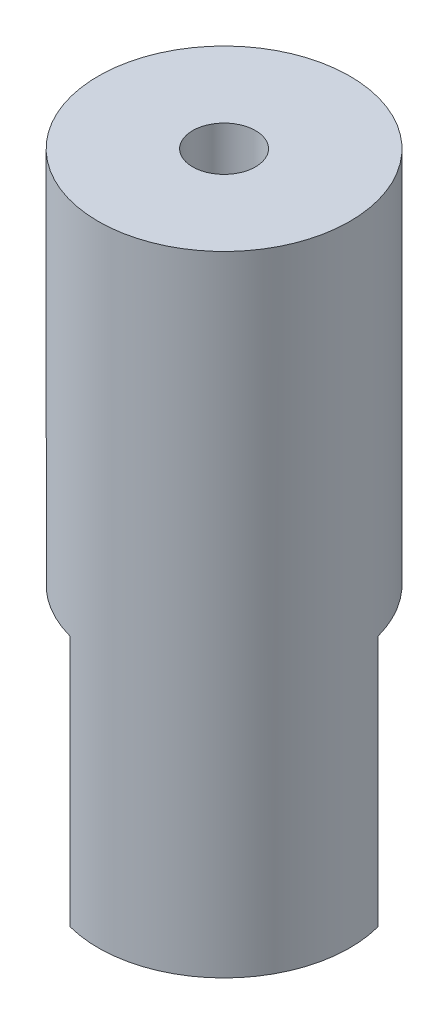
ISO-10303-21;
HEADER;
FILE_DESCRIPTION(('STEP AP214'),'2;1');
FILE_NAME('part.step','',(''),(''),'','','');
FILE_SCHEMA(('AUTOMOTIVE_DESIGN { 1 0 10303 214 1 1 1 1 }'));
ENDSEC;
DATA;
#1=APPLICATION_CONTEXT('core data for automotive mechanical design processes');
#2=APPLICATION_PROTOCOL_DEFINITION('international standard','automotive_design',2000,#1);
#3=PRODUCT_CONTEXT('',#1,'mechanical');
#4=PRODUCT('Part','Part','',(#3));
#5=PRODUCT_RELATED_PRODUCT_CATEGORY('part','',(#4));
#6=PRODUCT_DEFINITION_FORMATION('','',#4);
#7=PRODUCT_DEFINITION_CONTEXT('part definition',#1,'design');
#8=PRODUCT_DEFINITION('design','',#6,#7);
#9=PRODUCT_DEFINITION_SHAPE('','',#8);
#10=(LENGTH_UNIT() NAMED_UNIT(*) SI_UNIT(.MILLI.,.METRE.));
#11=(NAMED_UNIT(*) PLANE_ANGLE_UNIT() SI_UNIT($,.RADIAN.));
#12=(NAMED_UNIT(*) SI_UNIT($,.STERADIAN.) SOLID_ANGLE_UNIT());
#13=UNCERTAINTY_MEASURE_WITH_UNIT(LENGTH_MEASURE(1.E-05),#10,'distance_accuracy_value','');
#14=(GEOMETRIC_REPRESENTATION_CONTEXT(3) GLOBAL_UNCERTAINTY_ASSIGNED_CONTEXT((#13)) GLOBAL_UNIT_ASSIGNED_CONTEXT((#10,
#11,#12)) REPRESENTATION_CONTEXT('',''));
#15=CARTESIAN_POINT('',(0.,0.,0.));
#16=DIRECTION('',(0.,0.,1.));
#17=DIRECTION('',(1.,0.,0.));
#18=AXIS2_PLACEMENT_3D('',#15,#16,#17);
#19=CARTESIAN_POINT('',(0.,0.,0.));
#20=DIRECTION('',(0.,1.,0.));
#21=DIRECTION('',(0.,0.,1.));
#22=AXIS2_PLACEMENT_3D('',#19,#20,#21);
#23=PLANE('',#22);
#24=CARTESIAN_POINT('',(0.,0.,0.));
#25=DIRECTION('',(0.,1.,0.));
#26=DIRECTION('',(0.,0.,1.));
#27=AXIS2_PLACEMENT_3D('',#24,#25,#26);
#28=CIRCLE('',#27,2.49999999999999);
#29=CARTESIAN_POINT('',(0.,0.,2.49999999999999));
#30=VERTEX_POINT('',#29);
#31=EDGE_CURVE('E70',#30,#30,#28,.T.);
#32=ORIENTED_EDGE('',*,*,#31,.T.);
#33=EDGE_LOOP('',(#32));
#34=FACE_BOUND('',#33,.T.);
#35=DIRECTION('',(0.707106781186548,0.,-0.707106781186548));
#36=VECTOR('',#35,1.);
#37=CARTESIAN_POINT('',(9.65925826289068,0.,-2.58819045102521));
#38=LINE('',#37,#36);
#39=CARTESIAN_POINT('',(-2.58819045102521,0.,9.65925826289068));
#40=VERTEX_POINT('',#39);
#41=CARTESIAN_POINT('',(9.65925826289068,0.,-2.58819045102521));
#42=VERTEX_POINT('',#41);
#43=EDGE_CURVE('E54',#40,#42,#38,.T.);
#44=ORIENTED_EDGE('',*,*,#43,.F.);
#45=CARTESIAN_POINT('',(0.,0.,0.));
#46=DIRECTION('',(0.,1.,0.));
#47=DIRECTION('',(0.,0.,1.));
#48=AXIS2_PLACEMENT_3D('',#45,#46,#47);
#49=CIRCLE('',#48,10.);
#50=EDGE_CURVE('E47',#42,#40,#49,.T.);
#51=ORIENTED_EDGE('',*,*,#50,.F.);
#52=EDGE_LOOP('',(#44,#51));
#53=FACE_BOUND('',#52,.T.);
#54=ADVANCED_FACE('F38',(#34,#53),#23,.F.);
#55=CARTESIAN_POINT('',(0.,30.,0.));
#56=DIRECTION('',(0.,-1.,0.));
#57=DIRECTION('',(0.,0.,-1.));
#58=AXIS2_PLACEMENT_3D('',#55,#56,#57);
#59=CYLINDRICAL_SURFACE('',#58,10.);
#60=CARTESIAN_POINT('',(0.,30.,0.));
#61=DIRECTION('',(0.,1.,0.));
#62=DIRECTION('',(0.,0.,1.));
#63=AXIS2_PLACEMENT_3D('',#60,#61,#62);
#64=CIRCLE('',#63,10.);
#65=CARTESIAN_POINT('',(0.,30.,10.));
#66=VERTEX_POINT('',#65);
#67=EDGE_CURVE('E11',#66,#66,#64,.T.);
#68=ORIENTED_EDGE('',*,*,#67,.F.);
#69=EDGE_LOOP('',(#68));
#70=FACE_BOUND('',#69,.T.);
#71=ORIENTED_EDGE('',*,*,#50,.T.);
#72=DIRECTION('',(0.,1.,0.));
#73=VECTOR('',#72,1.);
#74=CARTESIAN_POINT('',(-2.58819045102521,-20.,9.65925826289068));
#75=LINE('',#74,#73);
#76=CARTESIAN_POINT('',(-2.58819045102521,-20.,9.65925826289068));
#77=VERTEX_POINT('',#76);
#78=EDGE_CURVE('E76',#77,#40,#75,.T.);
#79=ORIENTED_EDGE('',*,*,#78,.F.);
#80=CARTESIAN_POINT('',(0.,-20.,0.));
#81=DIRECTION('',(0.,-1.,0.));
#82=DIRECTION('',(0.,0.,-1.));
#83=AXIS2_PLACEMENT_3D('',#80,#81,#82);
#84=CIRCLE('',#83,10.);
#85=CARTESIAN_POINT('',(9.65925826289068,-20.,-2.58819045102521));
#86=VERTEX_POINT('',#85);
#87=EDGE_CURVE('E77',#86,#77,#84,.T.);
#88=ORIENTED_EDGE('',*,*,#87,.F.);
#89=DIRECTION('',(0.,1.,0.));
#90=VECTOR('',#89,1.);
#91=CARTESIAN_POINT('',(9.65925826289068,-20.,-2.58819045102521));
#92=LINE('',#91,#90);
#93=EDGE_CURVE('E74',#86,#42,#92,.T.);
#94=ORIENTED_EDGE('',*,*,#93,.T.);
#95=EDGE_LOOP('',(#71,#79,#88,#94));
#96=FACE_BOUND('',#95,.T.);
#97=ADVANCED_FACE('F40',(#70,#96),#59,.T.);
#98=CARTESIAN_POINT('',(0.,30.,0.));
#99=DIRECTION('',(0.,1.,0.));
#100=DIRECTION('',(0.,0.,1.));
#101=AXIS2_PLACEMENT_3D('',#98,#99,#100);
#102=PLANE('',#101);
#103=CARTESIAN_POINT('',(0.,30.,0.));
#104=DIRECTION('',(0.,1.,0.));
#105=DIRECTION('',(0.,0.,1.));
#106=AXIS2_PLACEMENT_3D('',#103,#104,#105);
#107=CIRCLE('',#106,2.5);
#108=CARTESIAN_POINT('',(0.,30.,2.5));
#109=VERTEX_POINT('',#108);
#110=EDGE_CURVE('E80',#109,#109,#107,.T.);
#111=ORIENTED_EDGE('',*,*,#110,.F.);
#112=EDGE_LOOP('',(#111));
#113=FACE_BOUND('',#112,.T.);
#114=ORIENTED_EDGE('',*,*,#67,.T.);
#115=EDGE_LOOP('',(#114));
#116=FACE_BOUND('',#115,.T.);
#117=ADVANCED_FACE('F99',(#113,#116),#102,.T.);
#118=CARTESIAN_POINT('',(0.,30.,0.));
#119=DIRECTION('',(0.,1.,0.));
#120=DIRECTION('',(0.,0.,1.));
#121=AXIS2_PLACEMENT_3D('',#118,#119,#120);
#122=CYLINDRICAL_SURFACE('',#121,2.49999999999999);
#123=ORIENTED_EDGE('',*,*,#31,.F.);
#124=EDGE_LOOP('',(#123));
#125=FACE_BOUND('',#124,.T.);
#126=ORIENTED_EDGE('',*,*,#110,.T.);
#127=EDGE_LOOP('',(#126));
#128=FACE_BOUND('',#127,.T.);
#129=ADVANCED_FACE('F96',(#125,#128),#122,.F.);
#130=CARTESIAN_POINT('',(9.65925826289068,-20.,-2.58819045102521));
#131=DIRECTION('',(0.707106781186548,0.,0.707106781186548));
#132=DIRECTION('',(0.707106781186548,0.,-0.707106781186548));
#133=AXIS2_PLACEMENT_3D('',#130,#131,#132);
#134=PLANE('',#133);
#135=ORIENTED_EDGE('',*,*,#43,.T.);
#136=ORIENTED_EDGE('',*,*,#93,.F.);
#137=DIRECTION('',(0.707106781186548,0.,-0.707106781186548));
#138=VECTOR('',#137,1.);
#139=CARTESIAN_POINT('',(9.65925826289068,-20.,-2.58819045102521));
#140=LINE('',#139,#138);
#141=EDGE_CURVE('E62',#77,#86,#140,.T.);
#142=ORIENTED_EDGE('',*,*,#141,.F.);
#143=ORIENTED_EDGE('',*,*,#78,.T.);
#144=EDGE_LOOP('',(#135,#136,#142,#143));
#145=FACE_BOUND('',#144,.T.);
#146=ADVANCED_FACE('F73',(#145),#134,.F.);
#147=CARTESIAN_POINT('',(0.,-20.,0.));
#148=DIRECTION('',(0.,-1.,0.));
#149=DIRECTION('',(0.,0.,-1.));
#150=AXIS2_PLACEMENT_3D('',#147,#148,#149);
#151=PLANE('',#150);
#152=ORIENTED_EDGE('',*,*,#87,.T.);
#153=ORIENTED_EDGE('',*,*,#141,.T.);
#154=EDGE_LOOP('',(#152,#153));
#155=FACE_BOUND('',#154,.T.);
#156=ADVANCED_FACE('F117',(#155),#151,.T.);
#157=CLOSED_SHELL('',(#54,#97,#117,#129,#146,#156));
#158=MANIFOLD_SOLID_BREP('B2',#157);
#159=ADVANCED_BREP_SHAPE_REPRESENTATION('',(#18,#158),#14);
#160=SHAPE_DEFINITION_REPRESENTATION(#9,#159);
ENDSEC;
END-ISO-10303-21;
